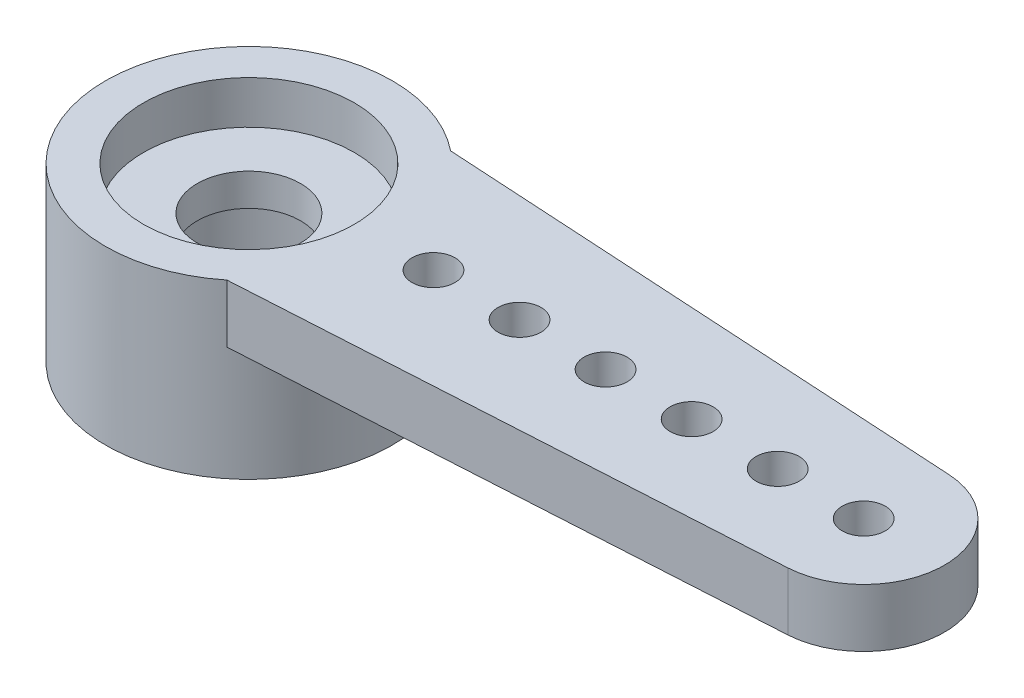
ISO-10303-21;
HEADER;
FILE_DESCRIPTION(('STEP AP214'),'2;1');
FILE_NAME('part.step','',(''),(''),'','','');
FILE_SCHEMA(('AUTOMOTIVE_DESIGN { 1 0 10303 214 1 1 1 1 }'));
ENDSEC;
DATA;
#1=APPLICATION_CONTEXT('core data for automotive mechanical design processes');
#2=APPLICATION_PROTOCOL_DEFINITION('international standard','automotive_design',2000,#1);
#3=PRODUCT_CONTEXT('',#1,'mechanical');
#4=PRODUCT('Part','Part','',(#3));
#5=PRODUCT_RELATED_PRODUCT_CATEGORY('part','',(#4));
#6=PRODUCT_DEFINITION_FORMATION('','',#4);
#7=PRODUCT_DEFINITION_CONTEXT('part definition',#1,'design');
#8=PRODUCT_DEFINITION('design','',#6,#7);
#9=PRODUCT_DEFINITION_SHAPE('','',#8);
#10=(LENGTH_UNIT() NAMED_UNIT(*) SI_UNIT(.MILLI.,.METRE.));
#11=(NAMED_UNIT(*) PLANE_ANGLE_UNIT() SI_UNIT($,.RADIAN.));
#12=(NAMED_UNIT(*) SI_UNIT($,.STERADIAN.) SOLID_ANGLE_UNIT());
#13=UNCERTAINTY_MEASURE_WITH_UNIT(LENGTH_MEASURE(1.E-05),#10,'distance_accuracy_value','');
#14=(GEOMETRIC_REPRESENTATION_CONTEXT(3) GLOBAL_UNCERTAINTY_ASSIGNED_CONTEXT((#13)) GLOBAL_UNIT_ASSIGNED_CONTEXT((#10,
#11,#12)) REPRESENTATION_CONTEXT('',''));
#15=CARTESIAN_POINT('',(0.,0.,0.));
#16=DIRECTION('',(0.,0.,1.));
#17=DIRECTION('',(1.,0.,0.));
#18=AXIS2_PLACEMENT_3D('',#15,#16,#17);
#19=CARTESIAN_POINT('',(3.335,0.,0.));
#20=DIRECTION('',(0.,-1.,0.));
#21=DIRECTION('',(0.,0.,-1.));
#22=AXIS2_PLACEMENT_3D('',#19,#20,#21);
#23=PLANE('',#22);
#24=CARTESIAN_POINT('',(0.,0.,0.));
#25=DIRECTION('',(0.,-1.,0.));
#26=DIRECTION('',(0.,0.,-1.));
#27=AXIS2_PLACEMENT_3D('',#24,#25,#26);
#28=CIRCLE('',#27,3.335);
#29=CARTESIAN_POINT('',(0.,0.,-3.335));
#30=VERTEX_POINT('',#29);
#31=EDGE_CURVE('E107',#30,#30,#28,.T.);
#32=ORIENTED_EDGE('',*,*,#31,.T.);
#33=EDGE_LOOP('',(#32));
#34=FACE_BOUND('',#33,.T.);
#35=CARTESIAN_POINT('',(0.,0.,0.));
#36=DIRECTION('',(0.,-1.,0.));
#37=DIRECTION('',(0.,0.,-1.));
#38=AXIS2_PLACEMENT_3D('',#35,#36,#37);
#39=CIRCLE('',#38,2.45);
#40=CARTESIAN_POINT('',(0.,0.,-2.45));
#41=VERTEX_POINT('',#40);
#42=EDGE_CURVE('E11',#41,#41,#39,.T.);
#43=ORIENTED_EDGE('',*,*,#42,.F.);
#44=EDGE_LOOP('',(#43));
#45=FACE_BOUND('',#44,.T.);
#46=ADVANCED_FACE('F33',(#34,#45),#23,.T.);
#47=CARTESIAN_POINT('',(0.,0.,0.));
#48=DIRECTION('',(0.,-1.,0.));
#49=DIRECTION('',(0.,0.,-1.));
#50=AXIS2_PLACEMENT_3D('',#47,#48,#49);
#51=CYLINDRICAL_SURFACE('',#50,2.45);
#52=ORIENTED_EDGE('',*,*,#42,.T.);
#53=EDGE_LOOP('',(#52));
#54=FACE_BOUND('',#53,.T.);
#55=CARTESIAN_POINT('',(0.,2.25,0.));
#56=DIRECTION('',(0.,-1.,0.));
#57=DIRECTION('',(0.,0.,-1.));
#58=AXIS2_PLACEMENT_3D('',#55,#56,#57);
#59=CIRCLE('',#58,2.45);
#60=CARTESIAN_POINT('',(0.,2.25,-2.45));
#61=VERTEX_POINT('',#60);
#62=EDGE_CURVE('E40',#61,#61,#59,.T.);
#63=ORIENTED_EDGE('',*,*,#62,.F.);
#64=EDGE_LOOP('',(#63));
#65=FACE_BOUND('',#64,.T.);
#66=ADVANCED_FACE('F131',(#54,#65),#51,.F.);
#67=CARTESIAN_POINT('',(2.45,2.25,0.));
#68=DIRECTION('',(0.,-1.,0.));
#69=DIRECTION('',(0.,0.,-1.));
#70=AXIS2_PLACEMENT_3D('',#67,#68,#69);
#71=PLANE('',#70);
#72=ORIENTED_EDGE('',*,*,#62,.T.);
#73=EDGE_LOOP('',(#72));
#74=FACE_BOUND('',#73,.T.);
#75=CARTESIAN_POINT('',(0.,2.25,0.));
#76=DIRECTION('',(0.,-1.,0.));
#77=DIRECTION('',(0.,0.,-1.));
#78=AXIS2_PLACEMENT_3D('',#75,#76,#77);
#79=CIRCLE('',#78,1.2);
#80=CARTESIAN_POINT('',(0.,2.25,-1.2));
#81=VERTEX_POINT('',#80);
#82=EDGE_CURVE('E123',#81,#81,#79,.T.);
#83=ORIENTED_EDGE('',*,*,#82,.F.);
#84=EDGE_LOOP('',(#83));
#85=FACE_BOUND('',#84,.T.);
#86=ADVANCED_FACE('F128',(#74,#85),#71,.T.);
#87=CARTESIAN_POINT('',(0.,0.,0.));
#88=DIRECTION('',(0.,-1.,0.));
#89=DIRECTION('',(0.,0.,-1.));
#90=AXIS2_PLACEMENT_3D('',#87,#88,#89);
#91=CYLINDRICAL_SURFACE('',#90,1.2);
#92=ORIENTED_EDGE('',*,*,#82,.T.);
#93=EDGE_LOOP('',(#92));
#94=FACE_BOUND('',#93,.T.);
#95=CARTESIAN_POINT('',(0.,3.,0.));
#96=DIRECTION('',(0.,-1.,0.));
#97=DIRECTION('',(0.,0.,-1.));
#98=AXIS2_PLACEMENT_3D('',#95,#96,#97);
#99=CIRCLE('',#98,1.2);
#100=CARTESIAN_POINT('',(0.,3.,-1.2));
#101=VERTEX_POINT('',#100);
#102=EDGE_CURVE('E120',#101,#101,#99,.T.);
#103=ORIENTED_EDGE('',*,*,#102,.F.);
#104=EDGE_LOOP('',(#103));
#105=FACE_BOUND('',#104,.T.);
#106=ADVANCED_FACE('F138',(#94,#105),#91,.F.);
#107=CARTESIAN_POINT('',(1.2,3.,0.));
#108=DIRECTION('',(0.,1.,0.));
#109=DIRECTION('',(0.,0.,1.));
#110=AXIS2_PLACEMENT_3D('',#107,#108,#109);
#111=PLANE('',#110);
#112=ORIENTED_EDGE('',*,*,#102,.T.);
#113=EDGE_LOOP('',(#112));
#114=FACE_BOUND('',#113,.T.);
#115=CARTESIAN_POINT('',(0.,3.,0.));
#116=DIRECTION('',(0.,-1.,0.));
#117=DIRECTION('',(0.,0.,-1.));
#118=AXIS2_PLACEMENT_3D('',#115,#116,#117);
#119=CIRCLE('',#118,2.45);
#120=CARTESIAN_POINT('',(0.,3.,-2.45));
#121=VERTEX_POINT('',#120);
#122=EDGE_CURVE('E117',#121,#121,#119,.T.);
#123=ORIENTED_EDGE('',*,*,#122,.F.);
#124=EDGE_LOOP('',(#123));
#125=FACE_BOUND('',#124,.T.);
#126=ADVANCED_FACE('F144',(#114,#125),#111,.T.);
#127=CARTESIAN_POINT('',(0.,0.,0.));
#128=DIRECTION('',(0.,-1.,0.));
#129=DIRECTION('',(0.,0.,-1.));
#130=AXIS2_PLACEMENT_3D('',#127,#128,#129);
#131=CYLINDRICAL_SURFACE('',#130,2.45);
#132=ORIENTED_EDGE('',*,*,#122,.T.);
#133=EDGE_LOOP('',(#132));
#134=FACE_BOUND('',#133,.T.);
#135=CARTESIAN_POINT('',(0.,4.,0.));
#136=DIRECTION('',(0.,-1.,0.));
#137=DIRECTION('',(0.,0.,-1.));
#138=AXIS2_PLACEMENT_3D('',#135,#136,#137);
#139=CIRCLE('',#138,2.45);
#140=CARTESIAN_POINT('',(0.,4.,-2.45));
#141=VERTEX_POINT('',#140);
#142=EDGE_CURVE('E114',#141,#141,#139,.T.);
#143=ORIENTED_EDGE('',*,*,#142,.F.);
#144=EDGE_LOOP('',(#143));
#145=FACE_BOUND('',#144,.T.);
#146=ADVANCED_FACE('F148',(#134,#145),#131,.F.);
#147=CARTESIAN_POINT('',(2.45,4.,0.));
#148=DIRECTION('',(0.,1.,0.));
#149=DIRECTION('',(0.,0.,1.));
#150=AXIS2_PLACEMENT_3D('',#147,#148,#149);
#151=PLANE('',#150);
#152=ORIENTED_EDGE('',*,*,#142,.T.);
#153=EDGE_LOOP('',(#152));
#154=FACE_BOUND('',#153,.T.);
#155=CARTESIAN_POINT('',(0.,4.,0.));
#156=DIRECTION('',(0.,-1.,0.));
#157=DIRECTION('',(0.,0.,-1.));
#158=AXIS2_PLACEMENT_3D('',#155,#156,#157);
#159=CIRCLE('',#158,3.335);
#160=CARTESIAN_POINT('',(2.088594024697,4.,2.6));
#161=VERTEX_POINT('',#160);
#162=CARTESIAN_POINT('',(2.088594024697,4.,-2.6));
#163=VERTEX_POINT('',#162);
#164=EDGE_CURVE('E112',#161,#163,#159,.T.);
#165=ORIENTED_EDGE('',*,*,#164,.F.);
#166=DIRECTION('',(0.9982706856489,0.,-0.0587846763542595));
#167=VECTOR('',#166,1.);
#168=CARTESIAN_POINT('',(14.4004122055759,4.,1.875));
#169=LINE('',#168,#167);
#170=CARTESIAN_POINT('',(14.4004122055759,4.,1.875));
#171=VERTEX_POINT('',#170);
#172=EDGE_CURVE('E100',#161,#171,#169,.T.);
#173=ORIENTED_EDGE('',*,*,#172,.T.);
#174=CARTESIAN_POINT('',(14.29,4.,0.));
#175=DIRECTION('',(0.,1.,0.));
#176=DIRECTION('',(0.,0.,-1.));
#177=AXIS2_PLACEMENT_3D('',#174,#175,#176);
#178=CIRCLE('',#177,1.87824808136203);
#179=CARTESIAN_POINT('',(14.4004122055759,4.,-1.875));
#180=VERTEX_POINT('',#179);
#181=EDGE_CURVE('E78',#171,#180,#178,.T.);
#182=ORIENTED_EDGE('',*,*,#181,.T.);
#183=DIRECTION('',(-0.9982706856489,0.,-0.0587846763542595));
#184=VECTOR('',#183,1.);
#185=CARTESIAN_POINT('',(2.088594024697,4.,-2.6));
#186=LINE('',#185,#184);
#187=EDGE_CURVE('E95',#180,#163,#186,.T.);
#188=ORIENTED_EDGE('',*,*,#187,.T.);
#189=EDGE_LOOP('',(#165,#173,#182,#188));
#190=FACE_BOUND('',#189,.T.);
#191=CARTESIAN_POINT('',(4.29,4.,2.07497281830382E-13));
#192=DIRECTION('',(0.,1.,0.));
#193=DIRECTION('',(0.,0.,1.));
#194=AXIS2_PLACEMENT_3D('',#191,#192,#193);
#195=CIRCLE('',#194,0.500000000000001);
#196=CARTESIAN_POINT('',(4.29,4.,0.500000000000208));
#197=VERTEX_POINT('',#196);
#198=EDGE_CURVE('E202',#197,#197,#195,.T.);
#199=ORIENTED_EDGE('',*,*,#198,.F.);
#200=EDGE_LOOP('',(#199));
#201=FACE_BOUND('',#200,.T.);
#202=CARTESIAN_POINT('',(6.29,4.,1.65997825464305E-13));
#203=DIRECTION('',(0.,1.,0.));
#204=DIRECTION('',(0.,0.,1.));
#205=AXIS2_PLACEMENT_3D('',#202,#203,#204);
#206=CIRCLE('',#205,0.500000000000002);
#207=CARTESIAN_POINT('',(6.29,4.,0.500000000000168));
#208=VERTEX_POINT('',#207);
#209=EDGE_CURVE('E205',#208,#208,#206,.T.);
#210=ORIENTED_EDGE('',*,*,#209,.F.);
#211=EDGE_LOOP('',(#210));
#212=FACE_BOUND('',#211,.T.);
#213=CARTESIAN_POINT('',(8.29,4.,1.24498369098229E-13));
#214=DIRECTION('',(0.,1.,0.));
#215=DIRECTION('',(0.,0.,1.));
#216=AXIS2_PLACEMENT_3D('',#213,#214,#215);
#217=CIRCLE('',#216,0.499999999999999);
#218=CARTESIAN_POINT('',(8.29,4.,0.500000000000123));
#219=VERTEX_POINT('',#218);
#220=EDGE_CURVE('E211',#219,#219,#217,.T.);
#221=ORIENTED_EDGE('',*,*,#220,.F.);
#222=EDGE_LOOP('',(#221));
#223=FACE_BOUND('',#222,.T.);
#224=CARTESIAN_POINT('',(10.29,4.,0.));
#225=DIRECTION('',(0.,1.,0.));
#226=DIRECTION('',(0.,0.,1.));
#227=AXIS2_PLACEMENT_3D('',#224,#225,#226);
#228=CIRCLE('',#227,0.500000000000001);
#229=CARTESIAN_POINT('',(10.29,4.,0.500000000000084));
#230=VERTEX_POINT('',#229);
#231=EDGE_CURVE('E217',#230,#230,#228,.T.);
#232=ORIENTED_EDGE('',*,*,#231,.F.);
#233=EDGE_LOOP('',(#232));
#234=FACE_BOUND('',#233,.T.);
#235=CARTESIAN_POINT('',(12.29,4.,0.));
#236=DIRECTION('',(0.,1.,0.));
#237=DIRECTION('',(0.,0.,1.));
#238=AXIS2_PLACEMENT_3D('',#235,#236,#237);
#239=CIRCLE('',#238,0.500000000000001);
#240=CARTESIAN_POINT('',(12.29,4.,0.500000000000042));
#241=VERTEX_POINT('',#240);
#242=EDGE_CURVE('E223',#241,#241,#239,.T.);
#243=ORIENTED_EDGE('',*,*,#242,.F.);
#244=EDGE_LOOP('',(#243));
#245=FACE_BOUND('',#244,.T.);
#246=CARTESIAN_POINT('',(14.29,4.,0.));
#247=DIRECTION('',(0.,1.,0.));
#248=DIRECTION('',(0.,0.,1.));
#249=AXIS2_PLACEMENT_3D('',#246,#247,#248);
#250=CIRCLE('',#249,0.500000000000001);
#251=CARTESIAN_POINT('',(14.29,4.,0.500000000000001));
#252=VERTEX_POINT('',#251);
#253=EDGE_CURVE('E229',#252,#252,#250,.T.);
#254=ORIENTED_EDGE('',*,*,#253,.F.);
#255=EDGE_LOOP('',(#254));
#256=FACE_BOUND('',#255,.T.);
#257=ADVANCED_FACE('F152',(#154,#190,#201,#212,#223,#234,#245,#256),#151,.T.);
#258=CARTESIAN_POINT('',(0.,0.,0.));
#259=DIRECTION('',(0.,-1.,0.));
#260=DIRECTION('',(0.,0.,-1.));
#261=AXIS2_PLACEMENT_3D('',#258,#259,#260);
#262=CYLINDRICAL_SURFACE('',#261,3.335);
#263=DIRECTION('',(0.,1.,0.));
#264=VECTOR('',#263,1.);
#265=CARTESIAN_POINT('',(2.088594024697,2.65,-2.6));
#266=LINE('',#265,#264);
#267=CARTESIAN_POINT('',(2.088594024697,2.65,-2.6));
#268=VERTEX_POINT('',#267);
#269=EDGE_CURVE('E52',#268,#163,#266,.T.);
#270=ORIENTED_EDGE('',*,*,#269,.F.);
#271=CARTESIAN_POINT('',(0.,2.65,0.));
#272=DIRECTION('',(0.,-1.,0.));
#273=DIRECTION('',(0.,0.,1.));
#274=AXIS2_PLACEMENT_3D('',#271,#272,#273);
#275=CIRCLE('',#274,3.335);
#276=CARTESIAN_POINT('',(2.088594024697,2.65,2.6));
#277=VERTEX_POINT('',#276);
#278=EDGE_CURVE('E47',#268,#277,#275,.T.);
#279=ORIENTED_EDGE('',*,*,#278,.T.);
#280=DIRECTION('',(0.,1.,0.));
#281=VECTOR('',#280,1.);
#282=CARTESIAN_POINT('',(2.088594024697,2.65,2.6));
#283=LINE('',#282,#281);
#284=EDGE_CURVE('E84',#277,#161,#283,.T.);
#285=ORIENTED_EDGE('',*,*,#284,.T.);
#286=ORIENTED_EDGE('',*,*,#164,.T.);
#287=EDGE_LOOP('',(#270,#279,#285,#286));
#288=FACE_BOUND('',#287,.T.);
#289=ORIENTED_EDGE('',*,*,#31,.F.);
#290=EDGE_LOOP('',(#289));
#291=FACE_BOUND('',#290,.T.);
#292=ADVANCED_FACE('F156',(#288,#291),#262,.T.);
#293=CARTESIAN_POINT('',(2.088594024697,2.65,-2.6));
#294=DIRECTION('',(0.0587846763542595,0.,-0.9982706856489));
#295=DIRECTION('',(-0.9982706856489,0.,-0.0587846763542595));
#296=AXIS2_PLACEMENT_3D('',#293,#294,#295);
#297=PLANE('',#296);
#298=ORIENTED_EDGE('',*,*,#187,.F.);
#299=DIRECTION('',(0.,1.,0.));
#300=VECTOR('',#299,1.);
#301=CARTESIAN_POINT('',(14.4004122055759,2.65,-1.875));
#302=LINE('',#301,#300);
#303=CARTESIAN_POINT('',(14.4004122055759,2.65,-1.875));
#304=VERTEX_POINT('',#303);
#305=EDGE_CURVE('E83',#304,#180,#302,.T.);
#306=ORIENTED_EDGE('',*,*,#305,.F.);
#307=DIRECTION('',(-0.9982706856489,0.,-0.0587846763542595));
#308=VECTOR('',#307,1.);
#309=CARTESIAN_POINT('',(2.088594024697,2.65,-2.6));
#310=LINE('',#309,#308);
#311=EDGE_CURVE('E91',#304,#268,#310,.T.);
#312=ORIENTED_EDGE('',*,*,#311,.T.);
#313=ORIENTED_EDGE('',*,*,#269,.T.);
#314=EDGE_LOOP('',(#298,#306,#312,#313));
#315=FACE_BOUND('',#314,.T.);
#316=ADVANCED_FACE('F160',(#315),#297,.T.);
#317=CARTESIAN_POINT('',(14.29,2.65,0.));
#318=DIRECTION('',(0.,1.,0.));
#319=DIRECTION('',(0.,0.,1.));
#320=AXIS2_PLACEMENT_3D('',#317,#318,#319);
#321=CYLINDRICAL_SURFACE('',#320,1.87824808136203);
#322=ORIENTED_EDGE('',*,*,#181,.F.);
#323=DIRECTION('',(0.,1.,0.));
#324=VECTOR('',#323,1.);
#325=CARTESIAN_POINT('',(14.4004122055759,2.65,1.875));
#326=LINE('',#325,#324);
#327=CARTESIAN_POINT('',(14.4004122055759,2.65,1.875));
#328=VERTEX_POINT('',#327);
#329=EDGE_CURVE('E72',#328,#171,#326,.T.);
#330=ORIENTED_EDGE('',*,*,#329,.F.);
#331=CARTESIAN_POINT('',(14.29,2.65,0.));
#332=DIRECTION('',(0.,1.,0.));
#333=DIRECTION('',(0.,0.,-1.));
#334=AXIS2_PLACEMENT_3D('',#331,#332,#333);
#335=CIRCLE('',#334,1.87824808136203);
#336=EDGE_CURVE('E75',#328,#304,#335,.T.);
#337=ORIENTED_EDGE('',*,*,#336,.T.);
#338=ORIENTED_EDGE('',*,*,#305,.T.);
#339=EDGE_LOOP('',(#322,#330,#337,#338));
#340=FACE_BOUND('',#339,.T.);
#341=ADVANCED_FACE('F74',(#340),#321,.T.);
#342=CARTESIAN_POINT('',(14.4004122055759,2.65,1.875));
#343=DIRECTION('',(0.0587846763542595,0.,0.9982706856489));
#344=DIRECTION('',(0.9982706856489,0.,-0.0587846763542595));
#345=AXIS2_PLACEMENT_3D('',#342,#343,#344);
#346=PLANE('',#345);
#347=ORIENTED_EDGE('',*,*,#172,.F.);
#348=ORIENTED_EDGE('',*,*,#284,.F.);
#349=DIRECTION('',(0.9982706856489,0.,-0.0587846763542595));
#350=VECTOR('',#349,1.);
#351=CARTESIAN_POINT('',(14.4004122055759,2.65,1.875));
#352=LINE('',#351,#350);
#353=EDGE_CURVE('E89',#277,#328,#352,.T.);
#354=ORIENTED_EDGE('',*,*,#353,.T.);
#355=ORIENTED_EDGE('',*,*,#329,.T.);
#356=EDGE_LOOP('',(#347,#348,#354,#355));
#357=FACE_BOUND('',#356,.T.);
#358=ADVANCED_FACE('F93',(#357),#346,.T.);
#359=CARTESIAN_POINT('',(0.,2.65,0.));
#360=DIRECTION('',(0.,1.,0.));
#361=DIRECTION('',(0.,0.,1.));
#362=AXIS2_PLACEMENT_3D('',#359,#360,#361);
#363=PLANE('',#362);
#364=CARTESIAN_POINT('',(4.29,2.65,2.07497281830382E-13));
#365=DIRECTION('',(0.,1.,0.));
#366=DIRECTION('',(0.,0.,1.));
#367=AXIS2_PLACEMENT_3D('',#364,#365,#366);
#368=CIRCLE('',#367,0.500000000000001);
#369=CARTESIAN_POINT('',(4.29,2.65,0.500000000000208));
#370=VERTEX_POINT('',#369);
#371=EDGE_CURVE('E199',#370,#370,#368,.T.);
#372=ORIENTED_EDGE('',*,*,#371,.T.);
#373=EDGE_LOOP('',(#372));
#374=FACE_BOUND('',#373,.T.);
#375=CARTESIAN_POINT('',(6.29,2.65,1.65997825464305E-13));
#376=DIRECTION('',(0.,1.,0.));
#377=DIRECTION('',(0.,0.,1.));
#378=AXIS2_PLACEMENT_3D('',#375,#376,#377);
#379=CIRCLE('',#378,0.500000000000002);
#380=CARTESIAN_POINT('',(6.29,2.65,0.500000000000168));
#381=VERTEX_POINT('',#380);
#382=EDGE_CURVE('E208',#381,#381,#379,.T.);
#383=ORIENTED_EDGE('',*,*,#382,.T.);
#384=EDGE_LOOP('',(#383));
#385=FACE_BOUND('',#384,.T.);
#386=CARTESIAN_POINT('',(8.29,2.65,1.24498369098229E-13));
#387=DIRECTION('',(0.,1.,0.));
#388=DIRECTION('',(0.,0.,1.));
#389=AXIS2_PLACEMENT_3D('',#386,#387,#388);
#390=CIRCLE('',#389,0.499999999999999);
#391=CARTESIAN_POINT('',(8.29,2.65,0.500000000000123));
#392=VERTEX_POINT('',#391);
#393=EDGE_CURVE('E214',#392,#392,#390,.T.);
#394=ORIENTED_EDGE('',*,*,#393,.T.);
#395=EDGE_LOOP('',(#394));
#396=FACE_BOUND('',#395,.T.);
#397=CARTESIAN_POINT('',(10.29,2.65,0.));
#398=DIRECTION('',(0.,1.,0.));
#399=DIRECTION('',(0.,0.,1.));
#400=AXIS2_PLACEMENT_3D('',#397,#398,#399);
#401=CIRCLE('',#400,0.500000000000001);
#402=CARTESIAN_POINT('',(10.29,2.65,0.500000000000084));
#403=VERTEX_POINT('',#402);
#404=EDGE_CURVE('E220',#403,#403,#401,.T.);
#405=ORIENTED_EDGE('',*,*,#404,.T.);
#406=EDGE_LOOP('',(#405));
#407=FACE_BOUND('',#406,.T.);
#408=CARTESIAN_POINT('',(12.29,2.65,0.));
#409=DIRECTION('',(0.,1.,0.));
#410=DIRECTION('',(0.,0.,1.));
#411=AXIS2_PLACEMENT_3D('',#408,#409,#410);
#412=CIRCLE('',#411,0.500000000000001);
#413=CARTESIAN_POINT('',(12.29,2.65,0.500000000000042));
#414=VERTEX_POINT('',#413);
#415=EDGE_CURVE('E226',#414,#414,#412,.T.);
#416=ORIENTED_EDGE('',*,*,#415,.T.);
#417=EDGE_LOOP('',(#416));
#418=FACE_BOUND('',#417,.T.);
#419=CARTESIAN_POINT('',(14.29,2.65,0.));
#420=DIRECTION('',(0.,1.,0.));
#421=DIRECTION('',(0.,0.,1.));
#422=AXIS2_PLACEMENT_3D('',#419,#420,#421);
#423=CIRCLE('',#422,0.500000000000001);
#424=CARTESIAN_POINT('',(14.29,2.65,0.500000000000001));
#425=VERTEX_POINT('',#424);
#426=EDGE_CURVE('E102',#425,#425,#423,.T.);
#427=ORIENTED_EDGE('',*,*,#426,.T.);
#428=EDGE_LOOP('',(#427));
#429=FACE_BOUND('',#428,.T.);
#430=ORIENTED_EDGE('',*,*,#278,.F.);
#431=ORIENTED_EDGE('',*,*,#311,.F.);
#432=ORIENTED_EDGE('',*,*,#336,.F.);
#433=ORIENTED_EDGE('',*,*,#353,.F.);
#434=EDGE_LOOP('',(#430,#431,#432,#433));
#435=FACE_BOUND('',#434,.T.);
#436=ADVANCED_FACE('F88',(#374,#385,#396,#407,#418,#429,#435),#363,.F.);
#437=CARTESIAN_POINT('',(14.29,2.65,0.));
#438=DIRECTION('',(0.,1.,0.));
#439=DIRECTION('',(0.,0.,1.));
#440=AXIS2_PLACEMENT_3D('',#437,#438,#439);
#441=CYLINDRICAL_SURFACE('',#440,0.500000000000001);
#442=ORIENTED_EDGE('',*,*,#426,.F.);
#443=EDGE_LOOP('',(#442));
#444=FACE_BOUND('',#443,.T.);
#445=ORIENTED_EDGE('',*,*,#253,.T.);
#446=EDGE_LOOP('',(#445));
#447=FACE_BOUND('',#446,.T.);
#448=ADVANCED_FACE('F170',(#444,#447),#441,.F.);
#449=CARTESIAN_POINT('',(12.29,2.65,0.));
#450=DIRECTION('',(0.,1.,0.));
#451=DIRECTION('',(0.,0.,1.));
#452=AXIS2_PLACEMENT_3D('',#449,#450,#451);
#453=CYLINDRICAL_SURFACE('',#452,0.500000000000001);
#454=ORIENTED_EDGE('',*,*,#415,.F.);
#455=EDGE_LOOP('',(#454));
#456=FACE_BOUND('',#455,.T.);
#457=ORIENTED_EDGE('',*,*,#242,.T.);
#458=EDGE_LOOP('',(#457));
#459=FACE_BOUND('',#458,.T.);
#460=ADVANCED_FACE('F174',(#456,#459),#453,.F.);
#461=CARTESIAN_POINT('',(10.29,2.65,0.));
#462=DIRECTION('',(0.,1.,0.));
#463=DIRECTION('',(0.,0.,1.));
#464=AXIS2_PLACEMENT_3D('',#461,#462,#463);
#465=CYLINDRICAL_SURFACE('',#464,0.500000000000001);
#466=ORIENTED_EDGE('',*,*,#404,.F.);
#467=EDGE_LOOP('',(#466));
#468=FACE_BOUND('',#467,.T.);
#469=ORIENTED_EDGE('',*,*,#231,.T.);
#470=EDGE_LOOP('',(#469));
#471=FACE_BOUND('',#470,.T.);
#472=ADVANCED_FACE('F178',(#468,#471),#465,.F.);
#473=CARTESIAN_POINT('',(8.29,2.65,1.24498369098229E-13));
#474=DIRECTION('',(0.,1.,0.));
#475=DIRECTION('',(0.,0.,1.));
#476=AXIS2_PLACEMENT_3D('',#473,#474,#475);
#477=CYLINDRICAL_SURFACE('',#476,0.499999999999999);
#478=ORIENTED_EDGE('',*,*,#393,.F.);
#479=EDGE_LOOP('',(#478));
#480=FACE_BOUND('',#479,.T.);
#481=ORIENTED_EDGE('',*,*,#220,.T.);
#482=EDGE_LOOP('',(#481));
#483=FACE_BOUND('',#482,.T.);
#484=ADVANCED_FACE('F182',(#480,#483),#477,.F.);
#485=CARTESIAN_POINT('',(6.29,2.65,1.65997825464305E-13));
#486=DIRECTION('',(0.,1.,0.));
#487=DIRECTION('',(0.,0.,1.));
#488=AXIS2_PLACEMENT_3D('',#485,#486,#487);
#489=CYLINDRICAL_SURFACE('',#488,0.500000000000002);
#490=ORIENTED_EDGE('',*,*,#382,.F.);
#491=EDGE_LOOP('',(#490));
#492=FACE_BOUND('',#491,.T.);
#493=ORIENTED_EDGE('',*,*,#209,.T.);
#494=EDGE_LOOP('',(#493));
#495=FACE_BOUND('',#494,.T.);
#496=ADVANCED_FACE('F186',(#492,#495),#489,.F.);
#497=CARTESIAN_POINT('',(4.29,2.65,2.07497281830382E-13));
#498=DIRECTION('',(0.,1.,0.));
#499=DIRECTION('',(0.,0.,1.));
#500=AXIS2_PLACEMENT_3D('',#497,#498,#499);
#501=CYLINDRICAL_SURFACE('',#500,0.500000000000001);
#502=ORIENTED_EDGE('',*,*,#371,.F.);
#503=EDGE_LOOP('',(#502));
#504=FACE_BOUND('',#503,.T.);
#505=ORIENTED_EDGE('',*,*,#198,.T.);
#506=EDGE_LOOP('',(#505));
#507=FACE_BOUND('',#506,.T.);
#508=ADVANCED_FACE('F190',(#504,#507),#501,.F.);
#509=CLOSED_SHELL('',(#46,#66,#86,#106,#126,#146,#257,#292,#316,#341,#358,#436,#448,#460,#472,
#484,#496,#508));
#510=MANIFOLD_SOLID_BREP('B2',#509);
#511=ADVANCED_BREP_SHAPE_REPRESENTATION('',(#18,#510),#14);
#512=SHAPE_DEFINITION_REPRESENTATION(#9,#511);
ENDSEC;
END-ISO-10303-21;
